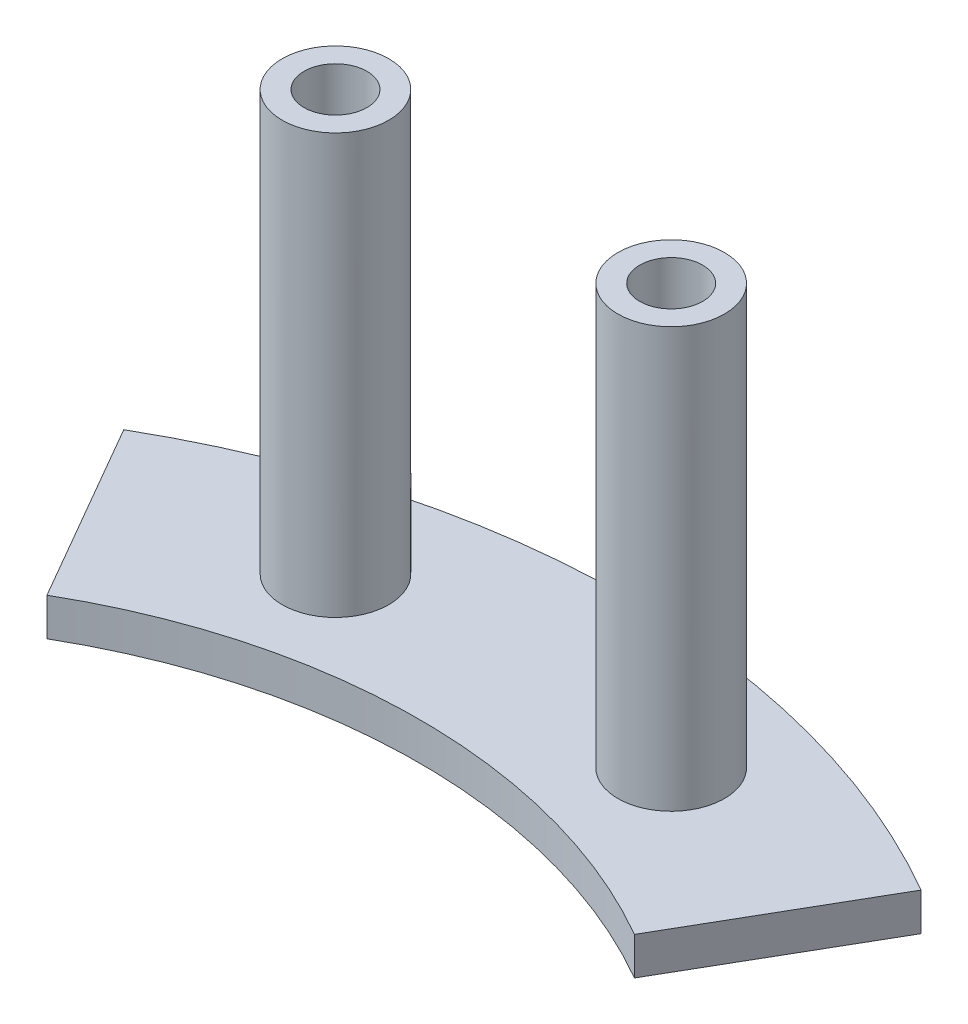
ISO-10303-21;
HEADER;
FILE_DESCRIPTION(('STEP AP214'),'2;1');
FILE_NAME('part.step','',(''),(''),'','','');
FILE_SCHEMA(('AUTOMOTIVE_DESIGN { 1 0 10303 214 1 1 1 1 }'));
ENDSEC;
DATA;
#1=APPLICATION_CONTEXT('core data for automotive mechanical design processes');
#2=APPLICATION_PROTOCOL_DEFINITION('international standard','automotive_design',2000,#1);
#3=PRODUCT_CONTEXT('',#1,'mechanical');
#4=PRODUCT('Part','Part','',(#3));
#5=PRODUCT_RELATED_PRODUCT_CATEGORY('part','',(#4));
#6=PRODUCT_DEFINITION_FORMATION('','',#4);
#7=PRODUCT_DEFINITION_CONTEXT('part definition',#1,'design');
#8=PRODUCT_DEFINITION('design','',#6,#7);
#9=PRODUCT_DEFINITION_SHAPE('','',#8);
#10=(LENGTH_UNIT() NAMED_UNIT(*) SI_UNIT(.MILLI.,.METRE.));
#11=(NAMED_UNIT(*) PLANE_ANGLE_UNIT() SI_UNIT($,.RADIAN.));
#12=(NAMED_UNIT(*) SI_UNIT($,.STERADIAN.) SOLID_ANGLE_UNIT());
#13=UNCERTAINTY_MEASURE_WITH_UNIT(LENGTH_MEASURE(1.E-05),#10,'distance_accuracy_value','');
#14=(GEOMETRIC_REPRESENTATION_CONTEXT(3) GLOBAL_UNCERTAINTY_ASSIGNED_CONTEXT((#13)) GLOBAL_UNIT_ASSIGNED_CONTEXT((#10,
#11,#12)) REPRESENTATION_CONTEXT('',''));
#15=CARTESIAN_POINT('',(0.,0.,0.));
#16=DIRECTION('',(0.,0.,1.));
#17=DIRECTION('',(1.,0.,0.));
#18=AXIS2_PLACEMENT_3D('',#15,#16,#17);
#19=CARTESIAN_POINT('',(0.,1.8,0.));
#20=DIRECTION('',(0.,-1.,0.));
#21=DIRECTION('',(0.,0.,-1.));
#22=AXIS2_PLACEMENT_3D('',#19,#20,#21);
#23=CYLINDRICAL_SURFACE('',#22,38.);
#24=CARTESIAN_POINT('',(0.,0.,0.));
#25=DIRECTION('',(0.,1.,0.));
#26=DIRECTION('',(0.,0.,-1.));
#27=AXIS2_PLACEMENT_3D('',#24,#25,#26);
#28=CIRCLE('',#27,38.);
#29=CARTESIAN_POINT('',(18.9999999999999,0.,-32.9089653438087));
#30=VERTEX_POINT('',#29);
#31=CARTESIAN_POINT('',(-19.0000000000001,0.,-32.9089653438086));
#32=VERTEX_POINT('',#31);
#33=EDGE_CURVE('E117',#30,#32,#28,.T.);
#34=ORIENTED_EDGE('',*,*,#33,.T.);
#35=DIRECTION('',(0.,-1.,0.));
#36=VECTOR('',#35,1.);
#37=CARTESIAN_POINT('',(-19.0000000000001,1.8,-32.9089653438086));
#38=LINE('',#37,#36);
#39=CARTESIAN_POINT('',(-19.0000000000001,1.8,-32.9089653438086));
#40=VERTEX_POINT('',#39);
#41=EDGE_CURVE('E106',#40,#32,#38,.T.);
#42=ORIENTED_EDGE('',*,*,#41,.F.);
#43=CARTESIAN_POINT('',(0.,1.8,0.));
#44=DIRECTION('',(0.,1.,0.));
#45=DIRECTION('',(0.,0.,-1.));
#46=AXIS2_PLACEMENT_3D('',#43,#44,#45);
#47=CIRCLE('',#46,38.);
#48=CARTESIAN_POINT('',(18.9999999999999,1.8,-32.9089653438087));
#49=VERTEX_POINT('',#48);
#50=EDGE_CURVE('E98',#49,#40,#47,.T.);
#51=ORIENTED_EDGE('',*,*,#50,.F.);
#52=DIRECTION('',(0.,-1.,0.));
#53=VECTOR('',#52,1.);
#54=CARTESIAN_POINT('',(18.9999999999999,1.8,-32.9089653438087));
#55=LINE('',#54,#53);
#56=EDGE_CURVE('E113',#49,#30,#55,.T.);
#57=ORIENTED_EDGE('',*,*,#56,.T.);
#58=EDGE_LOOP('',(#34,#42,#51,#57));
#59=FACE_BOUND('',#58,.T.);
#60=ADVANCED_FACE('F45',(#59),#23,.T.);
#61=CARTESIAN_POINT('',(-19.0000000000001,1.8,-32.9089653438086));
#62=DIRECTION('',(0.866025403784436,0.,-0.500000000000004));
#63=DIRECTION('',(-0.500000000000004,0.,-0.866025403784437));
#64=AXIS2_PLACEMENT_3D('',#61,#62,#63);
#65=PLANE('',#64);
#66=DIRECTION('',(0.500000000000004,0.,0.866025403784436));
#67=VECTOR('',#66,1.);
#68=CARTESIAN_POINT('',(-19.0000000000001,0.,-32.9089653438086));
#69=LINE('',#68,#67);
#70=CARTESIAN_POINT('',(-14.0000000000001,0.,-24.2487113059642));
#71=VERTEX_POINT('',#70);
#72=EDGE_CURVE('E104',#32,#71,#69,.T.);
#73=ORIENTED_EDGE('',*,*,#72,.T.);
#74=DIRECTION('',(0.,-1.,0.));
#75=VECTOR('',#74,1.);
#76=CARTESIAN_POINT('',(-14.0000000000001,1.8,-24.2487113059642));
#77=LINE('',#76,#75);
#78=CARTESIAN_POINT('',(-14.0000000000001,1.8,-24.2487113059642));
#79=VERTEX_POINT('',#78);
#80=EDGE_CURVE('E102',#79,#71,#77,.T.);
#81=ORIENTED_EDGE('',*,*,#80,.F.);
#82=DIRECTION('',(0.500000000000004,0.,0.866025403784436));
#83=VECTOR('',#82,1.);
#84=CARTESIAN_POINT('',(-19.0000000000001,1.8,-32.9089653438086));
#85=LINE('',#84,#83);
#86=EDGE_CURVE('E93',#40,#79,#85,.T.);
#87=ORIENTED_EDGE('',*,*,#86,.F.);
#88=ORIENTED_EDGE('',*,*,#41,.T.);
#89=EDGE_LOOP('',(#73,#81,#87,#88));
#90=FACE_BOUND('',#89,.T.);
#91=ADVANCED_FACE('F103',(#90),#65,.F.);
#92=CARTESIAN_POINT('',(0.,1.8,0.));
#93=DIRECTION('',(0.,-1.,0.));
#94=DIRECTION('',(0.,0.,-1.));
#95=AXIS2_PLACEMENT_3D('',#92,#93,#94);
#96=CYLINDRICAL_SURFACE('',#95,28.);
#97=CARTESIAN_POINT('',(0.,0.,0.));
#98=DIRECTION('',(0.,-1.,0.));
#99=DIRECTION('',(0.,0.,-1.));
#100=AXIS2_PLACEMENT_3D('',#97,#98,#99);
#101=CIRCLE('',#100,28.);
#102=CARTESIAN_POINT('',(13.9999999999999,0.,-24.2487113059643));
#103=VERTEX_POINT('',#102);
#104=EDGE_CURVE('E79',#71,#103,#101,.T.);
#105=ORIENTED_EDGE('',*,*,#104,.T.);
#106=DIRECTION('',(0.,-1.,0.));
#107=VECTOR('',#106,1.);
#108=CARTESIAN_POINT('',(13.9999999999999,1.8,-24.2487113059643));
#109=LINE('',#108,#107);
#110=CARTESIAN_POINT('',(13.9999999999999,1.8,-24.2487113059643));
#111=VERTEX_POINT('',#110);
#112=EDGE_CURVE('E107',#111,#103,#109,.T.);
#113=ORIENTED_EDGE('',*,*,#112,.F.);
#114=CARTESIAN_POINT('',(0.,1.8,0.));
#115=DIRECTION('',(0.,-1.,0.));
#116=DIRECTION('',(0.,0.,-1.));
#117=AXIS2_PLACEMENT_3D('',#114,#115,#116);
#118=CIRCLE('',#117,28.);
#119=EDGE_CURVE('E96',#79,#111,#118,.T.);
#120=ORIENTED_EDGE('',*,*,#119,.F.);
#121=ORIENTED_EDGE('',*,*,#80,.T.);
#122=EDGE_LOOP('',(#105,#113,#120,#121));
#123=FACE_BOUND('',#122,.T.);
#124=ADVANCED_FACE('F109',(#123),#96,.F.);
#125=CARTESIAN_POINT('',(18.9999999999999,1.8,-32.9089653438087));
#126=DIRECTION('',(-0.86602540378444,0.,-0.499999999999998));
#127=DIRECTION('',(-0.499999999999998,0.,0.86602540378444));
#128=AXIS2_PLACEMENT_3D('',#125,#126,#127);
#129=PLANE('',#128);
#130=DIRECTION('',(0.499999999999998,0.,-0.86602540378444));
#131=VECTOR('',#130,1.);
#132=CARTESIAN_POINT('',(18.9999999999999,0.,-32.9089653438087));
#133=LINE('',#132,#131);
#134=EDGE_CURVE('E85',#103,#30,#133,.T.);
#135=ORIENTED_EDGE('',*,*,#134,.T.);
#136=ORIENTED_EDGE('',*,*,#56,.F.);
#137=DIRECTION('',(0.499999999999998,0.,-0.86602540378444));
#138=VECTOR('',#137,1.);
#139=CARTESIAN_POINT('',(18.9999999999999,1.8,-32.9089653438087));
#140=LINE('',#139,#138);
#141=EDGE_CURVE('E62',#111,#49,#140,.T.);
#142=ORIENTED_EDGE('',*,*,#141,.F.);
#143=ORIENTED_EDGE('',*,*,#112,.T.);
#144=EDGE_LOOP('',(#135,#136,#142,#143));
#145=FACE_BOUND('',#144,.T.);
#146=ADVANCED_FACE('F141',(#145),#129,.F.);
#147=CARTESIAN_POINT('',(0.,1.8,0.));
#148=DIRECTION('',(0.,-1.,0.));
#149=DIRECTION('',(0.,0.,-1.));
#150=AXIS2_PLACEMENT_3D('',#147,#148,#149);
#151=PLANE('',#150);
#152=CARTESIAN_POINT('',(8.,1.8,-32.));
#153=DIRECTION('',(0.,-1.,0.));
#154=DIRECTION('',(0.,0.,-1.));
#155=AXIS2_PLACEMENT_3D('',#152,#153,#154);
#156=CIRCLE('',#155,2.54);
#157=CARTESIAN_POINT('',(8.,1.8,-34.54));
#158=VERTEX_POINT('',#157);
#159=EDGE_CURVE('E11',#158,#158,#156,.F.);
#160=ORIENTED_EDGE('',*,*,#159,.F.);
#161=EDGE_LOOP('',(#160));
#162=FACE_BOUND('',#161,.T.);
#163=CARTESIAN_POINT('',(-8.,1.8,-32.));
#164=DIRECTION('',(0.,-1.,0.));
#165=DIRECTION('',(0.,0.,-1.));
#166=AXIS2_PLACEMENT_3D('',#163,#164,#165);
#167=CIRCLE('',#166,2.54);
#168=CARTESIAN_POINT('',(-8.,1.8,-34.54));
#169=VERTEX_POINT('',#168);
#170=EDGE_CURVE('E54',#169,#169,#167,.F.);
#171=ORIENTED_EDGE('',*,*,#170,.F.);
#172=EDGE_LOOP('',(#171));
#173=FACE_BOUND('',#172,.T.);
#174=ORIENTED_EDGE('',*,*,#50,.T.);
#175=ORIENTED_EDGE('',*,*,#86,.T.);
#176=ORIENTED_EDGE('',*,*,#119,.T.);
#177=ORIENTED_EDGE('',*,*,#141,.T.);
#178=EDGE_LOOP('',(#174,#175,#176,#177));
#179=FACE_BOUND('',#178,.T.);
#180=ADVANCED_FACE('F94',(#162,#173,#179),#151,.F.);
#181=CARTESIAN_POINT('',(0.,0.,0.));
#182=DIRECTION('',(0.,-1.,0.));
#183=DIRECTION('',(0.,0.,-1.));
#184=AXIS2_PLACEMENT_3D('',#181,#182,#183);
#185=PLANE('',#184);
#186=ORIENTED_EDGE('',*,*,#33,.F.);
#187=ORIENTED_EDGE('',*,*,#134,.F.);
#188=ORIENTED_EDGE('',*,*,#104,.F.);
#189=ORIENTED_EDGE('',*,*,#72,.F.);
#190=EDGE_LOOP('',(#186,#187,#188,#189));
#191=FACE_BOUND('',#190,.T.);
#192=ADVANCED_FACE('F140',(#191),#185,.T.);
#193=CARTESIAN_POINT('',(-8.,21.8,-32.));
#194=DIRECTION('',(0.,-1.,0.));
#195=DIRECTION('',(0.,0.,-1.));
#196=AXIS2_PLACEMENT_3D('',#193,#194,#195);
#197=CYLINDRICAL_SURFACE('',#196,2.54);
#198=CARTESIAN_POINT('',(-8.,21.8,-32.));
#199=DIRECTION('',(0.,1.,0.));
#200=DIRECTION('',(0.,0.,1.));
#201=AXIS2_PLACEMENT_3D('',#198,#199,#200);
#202=CIRCLE('',#201,2.54);
#203=CARTESIAN_POINT('',(-8.,21.8,-29.46));
#204=VERTEX_POINT('',#203);
#205=EDGE_CURVE('E121',#204,#204,#202,.T.);
#206=ORIENTED_EDGE('',*,*,#205,.F.);
#207=EDGE_LOOP('',(#206));
#208=FACE_BOUND('',#207,.T.);
#209=ORIENTED_EDGE('',*,*,#170,.T.);
#210=EDGE_LOOP('',(#209));
#211=FACE_BOUND('',#210,.T.);
#212=ADVANCED_FACE('F137',(#208,#211),#197,.T.);
#213=CARTESIAN_POINT('',(-8.,21.8,-32.));
#214=DIRECTION('',(0.,1.,0.));
#215=DIRECTION('',(0.,0.,1.));
#216=AXIS2_PLACEMENT_3D('',#213,#214,#215);
#217=PLANE('',#216);
#218=CARTESIAN_POINT('',(-8.,21.8,-32.));
#219=DIRECTION('',(0.,1.,0.));
#220=DIRECTION('',(0.,0.,1.));
#221=AXIS2_PLACEMENT_3D('',#218,#219,#220);
#222=CIRCLE('',#221,1.5);
#223=CARTESIAN_POINT('',(-8.,21.8,-30.5));
#224=VERTEX_POINT('',#223);
#225=EDGE_CURVE('E178',#224,#224,#222,.T.);
#226=ORIENTED_EDGE('',*,*,#225,.F.);
#227=EDGE_LOOP('',(#226));
#228=FACE_BOUND('',#227,.T.);
#229=ORIENTED_EDGE('',*,*,#205,.T.);
#230=EDGE_LOOP('',(#229));
#231=FACE_BOUND('',#230,.T.);
#232=ADVANCED_FACE('F195',(#228,#231),#217,.T.);
#233=CARTESIAN_POINT('',(8.,21.8,-32.));
#234=DIRECTION('',(0.,-1.,0.));
#235=DIRECTION('',(0.,0.,-1.));
#236=AXIS2_PLACEMENT_3D('',#233,#234,#235);
#237=CYLINDRICAL_SURFACE('',#236,2.54);
#238=CARTESIAN_POINT('',(8.,21.8,-32.));
#239=DIRECTION('',(0.,1.,0.));
#240=DIRECTION('',(0.,0.,1.));
#241=AXIS2_PLACEMENT_3D('',#238,#239,#240);
#242=CIRCLE('',#241,2.54);
#243=CARTESIAN_POINT('',(8.,21.8,-29.46));
#244=VERTEX_POINT('',#243);
#245=EDGE_CURVE('E165',#244,#244,#242,.T.);
#246=ORIENTED_EDGE('',*,*,#245,.F.);
#247=EDGE_LOOP('',(#246));
#248=FACE_BOUND('',#247,.T.);
#249=ORIENTED_EDGE('',*,*,#159,.T.);
#250=EDGE_LOOP('',(#249));
#251=FACE_BOUND('',#250,.T.);
#252=ADVANCED_FACE('F198',(#248,#251),#237,.T.);
#253=CARTESIAN_POINT('',(8.,21.8,-32.));
#254=DIRECTION('',(0.,1.,0.));
#255=DIRECTION('',(0.,0.,1.));
#256=AXIS2_PLACEMENT_3D('',#253,#254,#255);
#257=PLANE('',#256);
#258=CARTESIAN_POINT('',(8.,21.8,-32.));
#259=DIRECTION('',(0.,1.,0.));
#260=DIRECTION('',(0.,0.,1.));
#261=AXIS2_PLACEMENT_3D('',#258,#259,#260);
#262=CIRCLE('',#261,1.5);
#263=CARTESIAN_POINT('',(8.,21.8,-30.5));
#264=VERTEX_POINT('',#263);
#265=EDGE_CURVE('E170',#264,#264,#262,.T.);
#266=ORIENTED_EDGE('',*,*,#265,.F.);
#267=EDGE_LOOP('',(#266));
#268=FACE_BOUND('',#267,.T.);
#269=ORIENTED_EDGE('',*,*,#245,.T.);
#270=EDGE_LOOP('',(#269));
#271=FACE_BOUND('',#270,.T.);
#272=ADVANCED_FACE('F207',(#268,#271),#257,.T.);
#273=CARTESIAN_POINT('',(8.,18.8,-32.));
#274=DIRECTION('',(0.,1.,0.));
#275=DIRECTION('',(0.,0.,1.));
#276=AXIS2_PLACEMENT_3D('',#273,#274,#275);
#277=CYLINDRICAL_SURFACE('',#276,1.5);
#278=CARTESIAN_POINT('',(8.,18.8,-32.));
#279=DIRECTION('',(0.,1.,0.));
#280=DIRECTION('',(0.,0.,1.));
#281=AXIS2_PLACEMENT_3D('',#278,#279,#280);
#282=CIRCLE('',#281,1.5);
#283=CARTESIAN_POINT('',(8.,18.8,-30.5));
#284=VERTEX_POINT('',#283);
#285=EDGE_CURVE('E174',#284,#284,#282,.T.);
#286=ORIENTED_EDGE('',*,*,#285,.F.);
#287=EDGE_LOOP('',(#286));
#288=FACE_BOUND('',#287,.T.);
#289=ORIENTED_EDGE('',*,*,#265,.T.);
#290=EDGE_LOOP('',(#289));
#291=FACE_BOUND('',#290,.T.);
#292=ADVANCED_FACE('F211',(#288,#291),#277,.F.);
#293=CARTESIAN_POINT('',(8.,18.8,-32.));
#294=DIRECTION('',(0.,1.,0.));
#295=DIRECTION('',(0.,0.,1.));
#296=AXIS2_PLACEMENT_3D('',#293,#294,#295);
#297=PLANE('',#296);
#298=ORIENTED_EDGE('',*,*,#285,.T.);
#299=EDGE_LOOP('',(#298));
#300=FACE_BOUND('',#299,.T.);
#301=ADVANCED_FACE('F191',(#300),#297,.T.);
#302=CARTESIAN_POINT('',(-8.,18.8,-32.));
#303=DIRECTION('',(0.,1.,0.));
#304=DIRECTION('',(0.,0.,1.));
#305=AXIS2_PLACEMENT_3D('',#302,#303,#304);
#306=CYLINDRICAL_SURFACE('',#305,1.5);
#307=CARTESIAN_POINT('',(-8.,18.8,-32.));
#308=DIRECTION('',(0.,1.,0.));
#309=DIRECTION('',(0.,0.,1.));
#310=AXIS2_PLACEMENT_3D('',#307,#308,#309);
#311=CIRCLE('',#310,1.5);
#312=CARTESIAN_POINT('',(-8.,18.8,-30.5));
#313=VERTEX_POINT('',#312);
#314=EDGE_CURVE('E169',#313,#313,#311,.T.);
#315=ORIENTED_EDGE('',*,*,#314,.F.);
#316=EDGE_LOOP('',(#315));
#317=FACE_BOUND('',#316,.T.);
#318=ORIENTED_EDGE('',*,*,#225,.T.);
#319=EDGE_LOOP('',(#318));
#320=FACE_BOUND('',#319,.T.);
#321=ADVANCED_FACE('F188',(#317,#320),#306,.F.);
#322=CARTESIAN_POINT('',(-8.,18.8,-32.));
#323=DIRECTION('',(0.,1.,0.));
#324=DIRECTION('',(0.,0.,1.));
#325=AXIS2_PLACEMENT_3D('',#322,#323,#324);
#326=PLANE('',#325);
#327=ORIENTED_EDGE('',*,*,#314,.T.);
#328=EDGE_LOOP('',(#327));
#329=FACE_BOUND('',#328,.T.);
#330=ADVANCED_FACE('F186',(#329),#326,.T.);
#331=CLOSED_SHELL('',(#60,#91,#124,#146,#180,#192,#212,#232,#252,#272,#292,#301,#321,#330));
#332=MANIFOLD_SOLID_BREP('B2',#331);
#333=ADVANCED_BREP_SHAPE_REPRESENTATION('',(#18,#332),#14);
#334=SHAPE_DEFINITION_REPRESENTATION(#9,#333);
ENDSEC;
END-ISO-10303-21;
